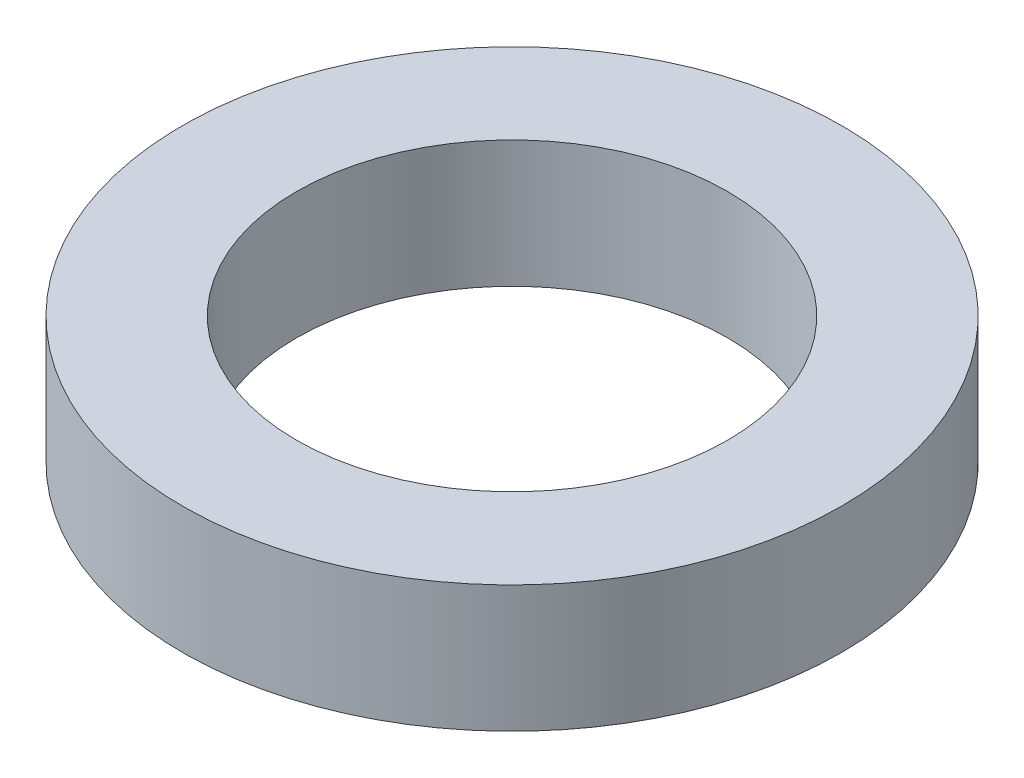
ISO-10303-21;
HEADER;
FILE_DESCRIPTION(('STEP AP214'),'2;1');
FILE_NAME('part.step','',(''),(''),'','','');
FILE_SCHEMA(('AUTOMOTIVE_DESIGN { 1 0 10303 214 1 1 1 1 }'));
ENDSEC;
DATA;
#1=APPLICATION_CONTEXT('core data for automotive mechanical design processes');
#2=APPLICATION_PROTOCOL_DEFINITION('international standard','automotive_design',2000,#1);
#3=PRODUCT_CONTEXT('',#1,'mechanical');
#4=PRODUCT('Part','Part','',(#3));
#5=PRODUCT_RELATED_PRODUCT_CATEGORY('part','',(#4));
#6=PRODUCT_DEFINITION_FORMATION('','',#4);
#7=PRODUCT_DEFINITION_CONTEXT('part definition',#1,'design');
#8=PRODUCT_DEFINITION('design','',#6,#7);
#9=PRODUCT_DEFINITION_SHAPE('','',#8);
#10=(LENGTH_UNIT() NAMED_UNIT(*) SI_UNIT(.MILLI.,.METRE.));
#11=(NAMED_UNIT(*) PLANE_ANGLE_UNIT() SI_UNIT($,.RADIAN.));
#12=(NAMED_UNIT(*) SI_UNIT($,.STERADIAN.) SOLID_ANGLE_UNIT());
#13=UNCERTAINTY_MEASURE_WITH_UNIT(LENGTH_MEASURE(1.E-05),#10,'distance_accuracy_value','');
#14=(GEOMETRIC_REPRESENTATION_CONTEXT(3) GLOBAL_UNCERTAINTY_ASSIGNED_CONTEXT((#13)) GLOBAL_UNIT_ASSIGNED_CONTEXT((#10,
#11,#12)) REPRESENTATION_CONTEXT('',''));
#15=CARTESIAN_POINT('',(0.,0.,0.));
#16=DIRECTION('',(0.,0.,1.));
#17=DIRECTION('',(1.,0.,0.));
#18=AXIS2_PLACEMENT_3D('',#15,#16,#17);
#19=CARTESIAN_POINT('',(0.,5.,0.));
#20=DIRECTION('',(0.,1.,0.));
#21=DIRECTION('',(0.,0.,1.));
#22=AXIS2_PLACEMENT_3D('',#19,#20,#21);
#23=PLANE('',#22);
#24=CARTESIAN_POINT('',(0.,5.,0.));
#25=DIRECTION('',(0.,1.,0.));
#26=DIRECTION('',(1.,0.,0.));
#27=AXIS2_PLACEMENT_3D('',#24,#25,#26);
#28=CIRCLE('',#27,13.);
#29=CARTESIAN_POINT('',(13.,5.,0.));
#30=VERTEX_POINT('',#29);
#31=EDGE_CURVE('E11',#30,#30,#28,.T.);
#32=ORIENTED_EDGE('',*,*,#31,.T.);
#33=EDGE_LOOP('',(#32));
#34=FACE_BOUND('',#33,.T.);
#35=CARTESIAN_POINT('',(0.,5.,0.));
#36=DIRECTION('',(0.,1.,0.));
#37=DIRECTION('',(0.,0.,1.));
#38=AXIS2_PLACEMENT_3D('',#35,#36,#37);
#39=CIRCLE('',#38,8.5);
#40=CARTESIAN_POINT('',(0.,5.,8.5));
#41=VERTEX_POINT('',#40);
#42=EDGE_CURVE('E50',#41,#41,#39,.T.);
#43=ORIENTED_EDGE('',*,*,#42,.F.);
#44=EDGE_LOOP('',(#43));
#45=FACE_BOUND('',#44,.T.);
#46=ADVANCED_FACE('F39',(#34,#45),#23,.T.);
#47=CARTESIAN_POINT('',(0.,0.,0.));
#48=DIRECTION('',(0.,1.,0.));
#49=DIRECTION('',(0.,0.,1.));
#50=AXIS2_PLACEMENT_3D('',#47,#48,#49);
#51=PLANE('',#50);
#52=CARTESIAN_POINT('',(0.,0.,0.));
#53=DIRECTION('',(0.,1.,0.));
#54=DIRECTION('',(1.,0.,0.));
#55=AXIS2_PLACEMENT_3D('',#52,#53,#54);
#56=CIRCLE('',#55,13.);
#57=CARTESIAN_POINT('',(13.,0.,0.));
#58=VERTEX_POINT('',#57);
#59=EDGE_CURVE('E43',#58,#58,#56,.T.);
#60=ORIENTED_EDGE('',*,*,#59,.F.);
#61=EDGE_LOOP('',(#60));
#62=FACE_BOUND('',#61,.T.);
#63=CARTESIAN_POINT('',(0.,0.,0.));
#64=DIRECTION('',(0.,1.,0.));
#65=DIRECTION('',(0.,0.,1.));
#66=AXIS2_PLACEMENT_3D('',#63,#64,#65);
#67=CIRCLE('',#66,8.5);
#68=CARTESIAN_POINT('',(0.,0.,8.5));
#69=VERTEX_POINT('',#68);
#70=EDGE_CURVE('E52',#69,#69,#67,.T.);
#71=ORIENTED_EDGE('',*,*,#70,.T.);
#72=EDGE_LOOP('',(#71));
#73=FACE_BOUND('',#72,.T.);
#74=ADVANCED_FACE('F62',(#62,#73),#51,.F.);
#75=CARTESIAN_POINT('',(0.,5.,0.));
#76=DIRECTION('',(0.,-1.,0.));
#77=DIRECTION('',(0.,0.,-1.));
#78=AXIS2_PLACEMENT_3D('',#75,#76,#77);
#79=CYLINDRICAL_SURFACE('',#78,13.);
#80=ORIENTED_EDGE('',*,*,#31,.F.);
#81=EDGE_LOOP('',(#80));
#82=FACE_BOUND('',#81,.T.);
#83=ORIENTED_EDGE('',*,*,#59,.T.);
#84=EDGE_LOOP('',(#83));
#85=FACE_BOUND('',#84,.T.);
#86=ADVANCED_FACE('F41',(#82,#85),#79,.T.);
#87=CARTESIAN_POINT('',(0.,5.,0.));
#88=DIRECTION('',(0.,-1.,0.));
#89=DIRECTION('',(0.,0.,-1.));
#90=AXIS2_PLACEMENT_3D('',#87,#88,#89);
#91=CYLINDRICAL_SURFACE('',#90,8.5);
#92=ORIENTED_EDGE('',*,*,#42,.T.);
#93=EDGE_LOOP('',(#92));
#94=FACE_BOUND('',#93,.T.);
#95=ORIENTED_EDGE('',*,*,#70,.F.);
#96=EDGE_LOOP('',(#95));
#97=FACE_BOUND('',#96,.T.);
#98=ADVANCED_FACE('F58',(#94,#97),#91,.F.);
#99=CLOSED_SHELL('',(#46,#74,#86,#98));
#100=MANIFOLD_SOLID_BREP('B2',#99);
#101=ADVANCED_BREP_SHAPE_REPRESENTATION('',(#18,#100),#14);
#102=SHAPE_DEFINITION_REPRESENTATION(#9,#101);
ENDSEC;
END-ISO-10303-21;
